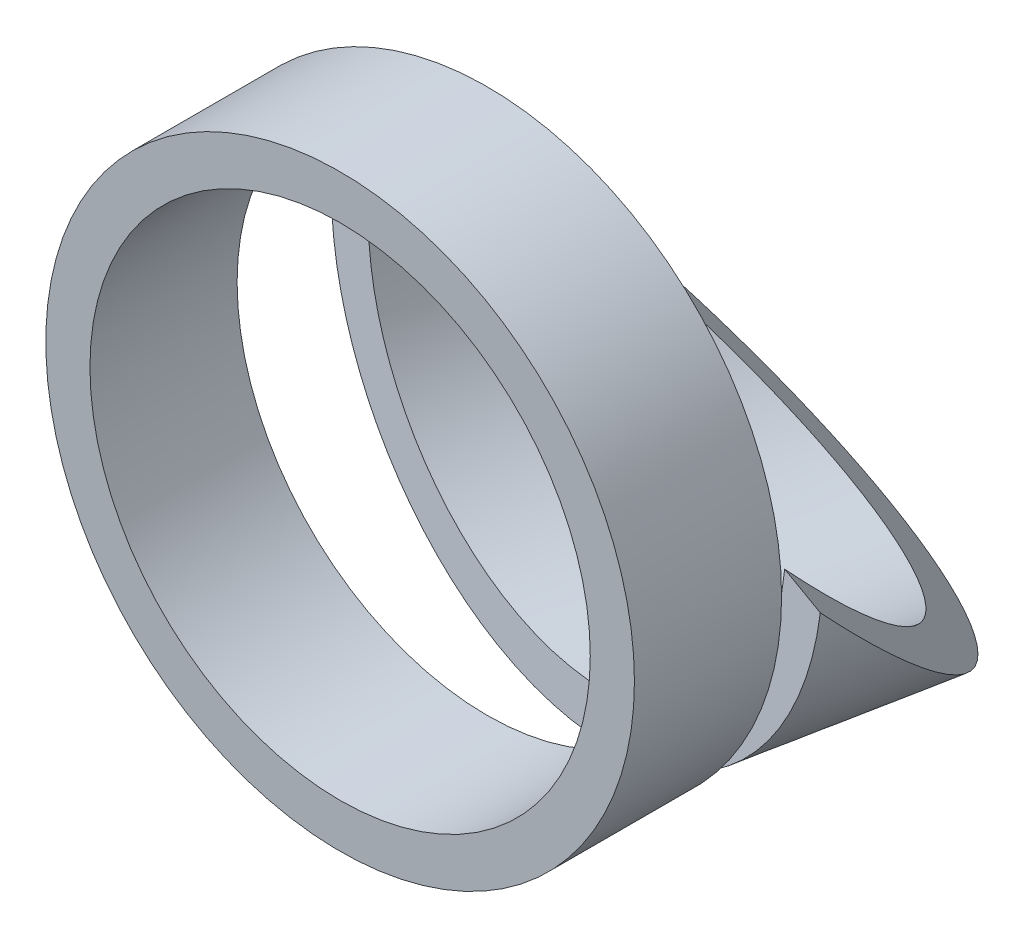
ISO-10303-21;
HEADER;
FILE_DESCRIPTION(('STEP AP214'),'2;1');
FILE_NAME('part.step','',(''),(''),'','','');
FILE_SCHEMA(('AUTOMOTIVE_DESIGN { 1 0 10303 214 1 1 1 1 }'));
ENDSEC;
DATA;
#1=APPLICATION_CONTEXT('core data for automotive mechanical design processes');
#2=APPLICATION_PROTOCOL_DEFINITION('international standard','automotive_design',2000,#1);
#3=PRODUCT_CONTEXT('',#1,'mechanical');
#4=PRODUCT('Part','Part','',(#3));
#5=PRODUCT_RELATED_PRODUCT_CATEGORY('part','',(#4));
#6=PRODUCT_DEFINITION_FORMATION('','',#4);
#7=PRODUCT_DEFINITION_CONTEXT('part definition',#1,'design');
#8=PRODUCT_DEFINITION('design','',#6,#7);
#9=PRODUCT_DEFINITION_SHAPE('','',#8);
#10=(LENGTH_UNIT() NAMED_UNIT(*) SI_UNIT(.MILLI.,.METRE.));
#11=(NAMED_UNIT(*) PLANE_ANGLE_UNIT() SI_UNIT($,.RADIAN.));
#12=(NAMED_UNIT(*) SI_UNIT($,.STERADIAN.) SOLID_ANGLE_UNIT());
#13=UNCERTAINTY_MEASURE_WITH_UNIT(LENGTH_MEASURE(1.E-05),#10,'distance_accuracy_value','');
#14=(GEOMETRIC_REPRESENTATION_CONTEXT(3) GLOBAL_UNCERTAINTY_ASSIGNED_CONTEXT((#13)) GLOBAL_UNIT_ASSIGNED_CONTEXT((#10,
#11,#12)) REPRESENTATION_CONTEXT('',''));
#15=CARTESIAN_POINT('',(0.,0.,0.));
#16=DIRECTION('',(0.,0.,1.));
#17=DIRECTION('',(1.,0.,0.));
#18=AXIS2_PLACEMENT_3D('',#15,#16,#17);
#19=CARTESIAN_POINT('',(11.6426036892653,-1.74656675486041,-76.7329363643441));
#20=DIRECTION('',(0.16261150339795,-0.0243941865043981,-0.986388575880442));
#21=DIRECTION('',(0.97547335491301,-0.146335766243948,0.164431071797738));
#22=AXIS2_PLACEMENT_3D('',#19,#20,#21);
#23=ELLIPSE('',#22,17.2345872769521,17.);
#24=DIRECTION('',(-0.16261150339795,0.0243941865043981,0.986388575880442));
#25=VECTOR('',#24,1.);
#26=SURFACE_OF_LINEAR_EXTRUSION('',#23,#25);
#27=CARTESIAN_POINT('',(-15.084528127993,7.83945222294181,-8.79046131717782));
#28=CARTESIAN_POINT('',(-15.1612871559026,7.60982072736204,-9.04367729737627));
#29=CARTESIAN_POINT('',(-15.2327465143917,7.37805778490592,-9.29652824119867));
#30=CARTESIAN_POINT('',(-15.3650949812378,6.91052197809162,-9.80127243261781));
#31=CARTESIAN_POINT('',(-15.4259844312444,6.6747492436119,-10.0531657109115));
#32=CARTESIAN_POINT('',(-15.5928355151237,5.96182868254518,-10.8070335999664));
#33=CARTESIAN_POINT('',(-15.6829977560136,5.47902487003708,-11.3072553771045));
#34=CARTESIAN_POINT('',(-15.8210783631235,4.50060333773139,-12.300814835782));
#35=CARTESIAN_POINT('',(-15.8689992040649,4.00498637034649,-12.7941529189374));
#36=CARTESIAN_POINT('',(-15.9222541193589,3.00281908147559,-13.7720003392433));
#37=CARTESIAN_POINT('',(-15.9275871977888,2.49626850458289,-14.2565094696629));
#38=CARTESIAN_POINT('',(-15.8949860998728,1.47409772179084,-15.2146178741231));
#39=CARTESIAN_POINT('',(-15.8570428829237,0.958475642974642,-15.6882148474784));
#40=CARTESIAN_POINT('',(-15.7368875187638,-0.0796918860772684,-16.6220038675259));
#41=CARTESIAN_POINT('',(-15.6546780266054,-0.602236919246954,-17.0821967164408));
#42=CARTESIAN_POINT('',(-15.4446273352371,-1.65232854250455,-17.9867329351233));
#43=CARTESIAN_POINT('',(-15.3167659946654,-2.17987724001914,-18.4310692137234));
#44=CARTESIAN_POINT('',(-15.0137435513343,-3.23736060342282,-19.3006495729018));
#45=CARTESIAN_POINT('',(-14.8385751180096,-3.76729562656489,-19.7258906826296));
#46=CARTESIAN_POINT('',(-14.439960665859,-4.82397599651715,-20.5515325488792));
#47=CARTESIAN_POINT('',(-14.2167522642607,-5.35072437312244,-20.9520435090919));
#48=CARTESIAN_POINT('',(-13.7195027496258,-6.39982821453417,-21.7259258924694));
#49=CARTESIAN_POINT('',(-13.445491461004,-6.92218606973253,-22.0993130608835));
#50=CARTESIAN_POINT('',(-12.8929395495554,-7.87450959022972,-22.7561091060301));
#51=CARTESIAN_POINT('',(-12.622296524753,-8.3057564955426,-23.0443043406795));
#52=CARTESIAN_POINT('',(-12.0418973119754,-9.15967294085565,-23.5948659438555));
#53=CARTESIAN_POINT('',(-11.7320856317831,-9.58232930423345,-23.8571947086341));
#54=CARTESIAN_POINT('',(-11.1153005476026,-10.3605504738456,-24.3192809616299));
#55=CARTESIAN_POINT('',(-10.8131395706411,-10.7177241336272,-24.5227431864797));
#56=CARTESIAN_POINT('',(-10.1781564578296,-11.418945283954,-24.9033268864074));
#57=CARTESIAN_POINT('',(-9.8453250788246,-11.7629887729862,-25.0804403784337));
#58=CARTESIAN_POINT('',(-9.14938788479239,-12.4338723000487,-25.404620796724));
#59=CARTESIAN_POINT('',(-8.78630659824553,-12.7607259324971,-25.5517117395526));
#60=CARTESIAN_POINT('',(-8.21977465625378,-13.2348395614637,-25.7470659864906));
#61=CARTESIAN_POINT('',(-8.02730497183963,-13.3901641730571,-25.8079642137614));
#62=CARTESIAN_POINT('',(-7.63515839157118,-13.6949437167717,-25.9209191593396));
#63=CARTESIAN_POINT('',(-7.43547973360242,-13.8443971948933,-25.9729736979677));
#64=CARTESIAN_POINT('',(-6.93536458773105,-14.2043341985135,-26.0896596213785));
#65=CARTESIAN_POINT('',(-6.63099133829897,-14.4111199666546,-26.1489936882329));
#66=CARTESIAN_POINT('',(-6.00878749966748,-14.8087090317112,-26.2463727657671));
#67=CARTESIAN_POINT('',(-5.69096005941419,-14.9995160376503,-26.2844227286695));
#68=CARTESIAN_POINT('',(-5.0435848944515,-15.3631143379301,-26.3380830415423));
#69=CARTESIAN_POINT('',(-4.71404560018054,-15.5359182526137,-26.3537092103166));
#70=CARTESIAN_POINT('',(-4.04503877552488,-15.8617900887659,-26.3616940687417));
#71=CARTESIAN_POINT('',(-3.70557101619074,-16.014857554673,-26.3540522214146));
#72=CARTESIAN_POINT('',(-3.0177107887568,-16.3001639723233,-26.3149145048581));
#73=CARTESIAN_POINT('',(-2.66928794146488,-16.43231676325,-26.2833229128123));
#74=CARTESIAN_POINT('',(-1.96753615035526,-16.6736952750359,-26.1961034554034));
#75=CARTESIAN_POINT('',(-1.61420721510935,-16.7829210359471,-26.1404756320307));
#76=CARTESIAN_POINT('',(-0.905498153477979,-16.9775176641537,-26.0055900943516));
#77=CARTESIAN_POINT('',(-0.550118005519189,-17.0628882800878,-25.9263321310728));
#78=CARTESIAN_POINT('',(0.159824285620089,-17.2093191323934,-25.7450486891533));
#79=CARTESIAN_POINT('',(0.514386446223996,-17.2703798914166,-25.6430237000675));
#80=CARTESIAN_POINT('',(1.19974580243534,-17.3654196533928,-25.4239326237744));
#81=CARTESIAN_POINT('',(1.53074084850867,-17.4007496649581,-25.3080629753883));
#82=CARTESIAN_POINT('',(2.18751352856131,-17.4502197644824,-25.0585129995009));
#83=CARTESIAN_POINT('',(2.51329149933987,-17.4643612258128,-24.9248338269654));
#84=CARTESIAN_POINT('',(3.15798699602995,-17.4721277431898,-24.6410478897222));
#85=CARTESIAN_POINT('',(3.47690180008586,-17.4657448051186,-24.4909347460859));
#86=CARTESIAN_POINT('',(4.10629198212567,-17.4333385769174,-24.1758277835739));
#87=CARTESIAN_POINT('',(4.41676573580707,-17.4073115340207,-24.0108311266882));
#88=CARTESIAN_POINT('',(5.13054742873222,-17.3247914602107,-23.6099136707745));
#89=CARTESIAN_POINT('',(5.53009159294354,-17.2610109129039,-23.3687570225641));
#90=CARTESIAN_POINT('',(6.30991526959748,-17.1029383600174,-22.866105897909));
#91=CARTESIAN_POINT('',(6.69018835721469,-17.0086362551881,-22.6046047114654));
#92=CARTESIAN_POINT('',(7.43033180118239,-16.7922020585684,-22.0643305677596));
#93=CARTESIAN_POINT('',(7.79018780110566,-16.6700506799525,-21.7855457387061));
#94=CARTESIAN_POINT('',(8.48836779710199,-16.4006568036999,-21.2138210157532));
#95=CARTESIAN_POINT('',(8.82669632874324,-16.2534196155312,-20.9208841265496));
#96=CARTESIAN_POINT('',(9.58884807068815,-15.8843786040724,-20.2254291031124));
#97=CARTESIAN_POINT('',(10.0044153420226,-15.6539411143143,-19.8184228373088));
#98=CARTESIAN_POINT('',(10.7967427494077,-15.1586895391894,-18.9892202909863));
#99=CARTESIAN_POINT('',(11.1735461976942,-14.893914585153,-18.5670416909811));
#100=CARTESIAN_POINT('',(11.8891454060057,-14.3344767288322,-17.7114053946686));
#101=CARTESIAN_POINT('',(12.2279759685019,-14.0398416732007,-17.2779584823319));
#102=CARTESIAN_POINT('',(12.8688661915241,-13.4241952805673,-16.4025691312291));
#103=CARTESIAN_POINT('',(13.1709157783733,-13.1031767577285,-15.960624403261));
#104=CARTESIAN_POINT('',(13.7387116702787,-12.4383556863263,-15.0714470845868));
#105=CARTESIAN_POINT('',(14.0044900638168,-12.0945736814578,-14.6242195531687));
#106=CARTESIAN_POINT('',(14.500817387675,-11.3867550409159,-13.7263989423116));
#107=CARTESIAN_POINT('',(14.7313690634156,-11.0227199866987,-13.2758061280223));
#108=CARTESIAN_POINT('',(15.1578627373144,-10.2768705823326,-12.3733308800427));
#109=CARTESIAN_POINT('',(15.3538194791602,-9.8950638942029,-11.9214490795358));
#110=CARTESIAN_POINT('',(15.7117536971458,-9.11566295668596,-11.0180067305567));
#111=CARTESIAN_POINT('',(15.8737301423105,-8.71806822871872,-10.5664461922458));
#112=CARTESIAN_POINT('',(16.3092525830641,-7.50435299423009,-9.21461016607336));
#113=CARTESIAN_POINT('',(16.5326708895886,-6.66680645451547,-8.316583072526));
#114=CARTESIAN_POINT('',(16.7515473075699,-5.46766564409504,-7.07646645858102));
#115=CARTESIAN_POINT('',(16.8032102593787,-5.12384621371022,-6.72590883296589));
#116=CARTESIAN_POINT('',(16.8855371106342,-4.43003067678897,-6.02839929085252));
#117=CARTESIAN_POINT('',(16.9162027996414,-4.08003509924366,-5.68144706955466));
#118=CARTESIAN_POINT('',(16.9565626783666,-3.37168246685846,-4.98905654633948));
#119=CARTESIAN_POINT('',(16.9660814689283,-3.01328021569215,-4.64365444889089));
#120=CARTESIAN_POINT('',(16.9633964195217,-2.29158516047545,-3.95800681293857));
#121=CARTESIAN_POINT('',(16.9511902064844,-1.92829182646346,-3.61776184185323));
#122=CARTESIAN_POINT('',(16.9280032856472,-1.56291546832154,-3.28049384118738));
#123=B_SPLINE_CURVE_WITH_KNOTS('',3,(#27,#28,#29,#30,#31,#32,#33,#34,#35,#36,#37,#38,#39,#40,
#41,#42,#43,#44,#45,#46,#47,#48,#49,#50,#51,#52,#53,#54,#55,#56,#57,#58,#59,#60,#61,#62,#63,#64,
#65,#66,#67,#68,#69,#70,#71,#72,#73,#74,#75,#76,#77,#78,#79,#80,#81,#82,#83,#84,#85,#86,#87,#88,
#89,#90,#91,#92,#93,#94,#95,#96,#97,#98,#99,#100,#101,#102,#103,#104,#105,#106,#107,#108,#109,
#110,#111,#112,#113,#114,#115,#116,#117,#118,#119,#120,#121,#122),.UNSPECIFIED.,.F.,.F.,(4,2,2,
2,2,2,2,2,2,2,2,2,2,2,2,2,2,2,2,2,2,2,2,2,2,2,2,2,2,2,2,2,2,2,2,2,2,2,2,2,2,2,2,2,2,2,2,4),(0.,
1.05093126493312,2.10182855444846,4.20337822235657,6.30480476234849,8.40628044444369,
10.5081952142102,12.6099839270158,14.7127010864378,16.8157442637531,18.9086150125486,
21.0002609858478,22.7536729473742,24.5095974941204,26.0384847992222,27.5678343822507,
29.0959557240452,29.8598214161957,30.6238751039291,31.7408590360565,32.8575829686853,
33.973518723549,35.0894802321033,36.209925708181,37.3303692268908,38.4508245512521,
39.5712557849979,40.6275028117572,41.6836813731287,42.7402713588777,43.7970632443684,
45.2080666664867,46.6195374523421,48.0319887280777,49.4441414258486,51.3184377468362,
53.1906165678065,55.0610652410008,56.9320250511877,58.8013187752338,60.6704667400939,
62.5388161772907,64.4072222927189,68.1415757917396,69.6224750652958,71.1032481086369,
72.5962580130963,74.0894310122632),.UNSPECIFIED.);
#124=CARTESIAN_POINT('',(-15.084528127993,7.83945222294181,-8.79046131717779));
#125=VERTEX_POINT('',#124);
#126=CARTESIAN_POINT('',(16.9280032856472,-1.5629154683215,-3.28049384118742));
#127=VERTEX_POINT('',#126);
#128=EDGE_CURVE('E12',#125,#127,#123,.T.);
#129=ORIENTED_EDGE('',*,*,#128,.F.);
#130=CARTESIAN_POINT('',(0.,0.,-6.10981910252094));
#131=DIRECTION('',(0.16261150339795,-0.0243941865043981,-0.986388575880442));
#132=DIRECTION('',(0.97547335491301,-0.146335766243948,0.164431071797738));
#133=AXIS2_PLACEMENT_3D('',#130,#131,#132);
#134=ELLIPSE('',#133,17.2345872769521,17.);
#135=EDGE_CURVE('E79',#127,#125,#134,.T.);
#136=ORIENTED_EDGE('',*,*,#135,.F.);
#137=EDGE_LOOP('',(#129,#136));
#138=FACE_BOUND('',#137,.T.);
#139=ADVANCED_FACE('F41',(#138),#26,.T.);
#140=CARTESIAN_POINT('',(11.6426036892653,-1.74656675486041,-76.7329363643441));
#141=DIRECTION('',(0.16261150339795,-0.0243941865043981,-0.986388575880442));
#142=DIRECTION('',(0.975473354913011,-0.146335766243947,0.164431071797738));
#143=AXIS2_PLACEMENT_3D('',#140,#141,#142);
#144=ELLIPSE('',#143,20.2759850317084,20.);
#145=DIRECTION('',(-0.16261150339795,0.0243941865043981,0.986388575880442));
#146=VECTOR('',#145,1.);
#147=SURFACE_OF_LINEAR_EXTRUSION('',#144,#146);
#148=CARTESIAN_POINT('',(0.,0.,-6.10981910252094));
#149=DIRECTION('',(0.16261150339795,-0.0243941865043981,-0.986388575880442));
#150=DIRECTION('',(0.975473354913011,-0.146335766243947,0.164431071797738));
#151=AXIS2_PLACEMENT_3D('',#148,#149,#150);
#152=ELLIPSE('',#151,20.2759850317084,20.);
#153=CARTESIAN_POINT('',(19.8528113921095,-2.42195785044404,-2.77707855884412));
#154=VERTEX_POINT('',#153);
#155=CARTESIAN_POINT('',(-18.0093362344553,8.69849460506436,-9.29387659952106));
#156=VERTEX_POINT('',#155);
#157=EDGE_CURVE('E82',#154,#156,#152,.T.);
#158=ORIENTED_EDGE('',*,*,#157,.T.);
#159=CARTESIAN_POINT('',(-18.0093362344553,8.69849460506436,-9.29387659952107));
#160=CARTESIAN_POINT('',(-18.0914126977773,8.42508600412214,-9.59115828242779));
#161=CARTESIAN_POINT('',(-18.16727083154,8.14928295631096,-9.88791032041356));
#162=CARTESIAN_POINT('',(-18.3065702934418,7.59317418992581,-10.4800916658109));
#163=CARTESIAN_POINT('',(-18.3700119641421,7.31286859580477,-10.7755210094948));
#164=CARTESIAN_POINT('',(-18.5417405274643,6.46564299976884,-11.6594142300617));
#165=CARTESIAN_POINT('',(-18.6314421643313,5.89237680219224,-12.2455239294427));
#166=CARTESIAN_POINT('',(-18.7610489110114,4.731527514306,-13.4088785065568));
#167=CARTESIAN_POINT('',(-18.8009557512911,4.14394492224263,-13.9861236916606));
#168=CARTESIAN_POINT('',(-18.8304437980177,2.95668178662402,-15.1293984308567));
#169=CARTESIAN_POINT('',(-18.8200248362866,2.35700120264654,-15.6954279474623));
#170=CARTESIAN_POINT('',(-18.7479357658123,1.1477024446657,-16.8137972550702));
#171=CARTESIAN_POINT('',(-18.6862520065336,0.538081666228179,-17.3661333595134));
#172=CARTESIAN_POINT('',(-18.5103294531923,-0.688481179262389,-18.4540369221401));
#173=CARTESIAN_POINT('',(-18.3960942834567,-1.30542273856309,-18.9896055340114));
#174=CARTESIAN_POINT('',(-18.1133109618741,-2.54435657780149,-20.0410191598345));
#175=CARTESIAN_POINT('',(-17.9447317958213,-3.16635154365945,-20.5568527224554));
#176=CARTESIAN_POINT('',(-17.5512037327571,-4.41200928488219,-21.5646476913425));
#177=CARTESIAN_POINT('',(-17.3262533028269,-5.03567210514501,-22.0566084479949));
#178=CARTESIAN_POINT('',(-16.8254969433132,-6.26158886901665,-22.9971854921561));
#179=CARTESIAN_POINT('',(-16.5514904024458,-6.86390535991127,-23.4466740042377));
#180=CARTESIAN_POINT('',(-15.9458911813112,-8.06249728991044,-24.3138927088897));
#181=CARTESIAN_POINT('',(-15.6143086922699,-8.65877377839021,-24.731628503065));
#182=CARTESIAN_POINT('',(-14.9489065476291,-9.74572787637618,-25.4655878305361));
#183=CARTESIAN_POINT('',(-14.6239094081072,-10.2380554420413,-25.7873663812077));
#184=CARTESIAN_POINT('',(-13.9301536755608,-11.2110638127263,-26.4000739678701));
#185=CARTESIAN_POINT('',(-13.5614006609854,-11.6917460930179,-26.6910069274383));
#186=CARTESIAN_POINT('',(-12.834238498173,-12.570270916617,-27.1987034317212));
#187=CARTESIAN_POINT('',(-12.481678040692,-12.970250911654,-27.4201428268158));
#188=CARTESIAN_POINT('',(-11.7433836584537,-13.7545434715208,-27.833127580188));
#189=CARTESIAN_POINT('',(-11.3576649951125,-14.1388631253977,-28.0246865781779));
#190=CARTESIAN_POINT('',(-10.6036770340228,-14.840964312226,-28.3523591386163));
#191=CARTESIAN_POINT('',(-10.2392686478517,-15.1610524108524,-28.4924117194957));
#192=CARTESIAN_POINT('',(-9.48556395197012,-15.7834588859924,-28.7443642026529));
#193=CARTESIAN_POINT('',(-9.0962434290237,-16.0857594090384,-28.8562361772724));
#194=CARTESIAN_POINT('',(-8.32919246949396,-16.6435603309996,-29.0406736246002));
#195=CARTESIAN_POINT('',(-7.95337912765805,-16.9008463937873,-29.1158044293149));
#196=CARTESIAN_POINT('',(-7.18391329461181,-17.3948277859898,-29.2384121014589));
#197=CARTESIAN_POINT('',(-6.79025633389364,-17.6315179126572,-29.2858819986073));
#198=CARTESIAN_POINT('',(-5.98727339833563,-18.0815748329745,-29.3515472973334));
#199=CARTESIAN_POINT('',(-5.57794293488235,-18.294934876824,-29.3697342476213));
#200=CARTESIAN_POINT('',(-4.74654583796233,-18.6956606735069,-29.3756162391459));
#201=CARTESIAN_POINT('',(-4.32448062912227,-18.8830293209484,-29.3633146787086));
#202=CARTESIAN_POINT('',(-3.48434912143259,-19.2240871716905,-29.3084638631567));
#203=CARTESIAN_POINT('',(-3.06657502242118,-19.3786507517037,-29.2668787528635));
#204=CARTESIAN_POINT('',(-2.2255330700482,-19.6597000438343,-29.1545046629459));
#205=CARTESIAN_POINT('',(-1.80226522105879,-19.7861857782958,-29.0837157065619));
#206=CARTESIAN_POINT('',(-0.953929022201056,-20.009975723801,-28.9135516029447));
#207=CARTESIAN_POINT('',(-0.528861298030382,-20.1072893469544,-28.8141856961157));
#208=CARTESIAN_POINT('',(0.319687287675094,-20.2723290343488,-28.5880111618489));
#209=CARTESIAN_POINT('',(0.743168195736665,-20.3400559729336,-28.4612033455384));
#210=CARTESIAN_POINT('',(1.55494098650931,-20.4422554345733,-28.1918315888147));
#211=CARTESIAN_POINT('',(1.94357411921073,-20.4787684712115,-28.0510555446422));
#212=CARTESIAN_POINT('',(2.7142366562433,-20.5269648247242,-27.7488547979791));
#213=CARTESIAN_POINT('',(3.0962665756419,-20.5386500869768,-27.5874317143364));
#214=CARTESIAN_POINT('',(3.85186365208308,-20.538042395987,-27.2455869278481));
#215=CARTESIAN_POINT('',(4.22542732667685,-20.5257397505223,-27.0651575734563));
#216=CARTESIAN_POINT('',(4.9622988585294,-20.478232250068,-26.6871341505519));
#217=CARTESIAN_POINT('',(5.32560471943387,-20.4430229686584,-26.4895367709294));
#218=CARTESIAN_POINT('',(6.1656744501092,-20.334825304689,-26.0071429678011));
#219=CARTESIAN_POINT('',(6.63768272653817,-20.2529310218234,-25.7160183832745));
#220=CARTESIAN_POINT('',(7.55818778390858,-20.0529522800451,-25.109944860691));
#221=CARTESIAN_POINT('',(8.0066764950507,-19.9348554936048,-24.7949878348663));
#222=CARTESIAN_POINT('',(8.87889665706182,-19.6657223368225,-24.1449057738648));
#223=CARTESIAN_POINT('',(9.302609765148,-19.5146619435683,-23.8097661598541));
#224=CARTESIAN_POINT('',(10.124005630698,-19.1829099369846,-23.1230425914489));
#225=CARTESIAN_POINT('',(10.5216939234505,-19.0022246535007,-22.7714621613512));
#226=CARTESIAN_POINT('',(11.4178079770291,-18.5501076783345,-21.9364368207348));
#227=CARTESIAN_POINT('',(11.9061906090423,-18.2684024658351,-21.4477502633185));
#228=CARTESIAN_POINT('',(12.8361305393569,-17.6643905432178,-20.4528841247966));
#229=CARTESIAN_POINT('',(13.277740698972,-17.3421305887975,-19.9467251677059));
#230=CARTESIAN_POINT('',(14.1151839210672,-16.6623550585856,-18.921528634352));
#231=CARTESIAN_POINT('',(14.5110585733737,-16.3048720700889,-18.4025032883625));
#232=CARTESIAN_POINT('',(15.2585478903114,-15.5588166868307,-17.3548538933039));
#233=CARTESIAN_POINT('',(15.6101500702578,-15.1702355728062,-16.826227184557));
#234=CARTESIAN_POINT('',(16.2696880153101,-14.3662543101472,-15.7631712257544));
#235=CARTESIAN_POINT('',(16.5776616606626,-13.9508778882002,-15.2287474484846));
#236=CARTESIAN_POINT('',(17.1512104367657,-13.0963065988369,-14.1563804607718));
#237=CARTESIAN_POINT('',(17.416789747842,-12.6571140855531,-13.6184376027825));
#238=CARTESIAN_POINT('',(17.906273570856,-11.7578746982735,-12.5415266011522));
#239=CARTESIAN_POINT('',(18.1301964669281,-11.2978371357854,-12.0025590163528));
#240=CARTESIAN_POINT('',(18.5371463160348,-10.3591274445843,-10.9253594393491));
#241=CARTESIAN_POINT('',(18.7201689474261,-9.88045335294913,-10.3871275308446));
#242=CARTESIAN_POINT('',(19.0641247074186,-8.85157653011757,-9.25256436572503));
#243=CARTESIAN_POINT('',(19.2202192388794,-8.29940641295968,-8.65654604361283));
#244=CARTESIAN_POINT('',(19.4824620704875,-7.17749068946817,-7.47034052436699));
#245=CARTESIAN_POINT('',(19.5886182547372,-6.60774787259924,-6.88015242119101));
#246=CARTESIAN_POINT('',(19.7521662791647,-5.44432767716395,-5.69902140549677));
#247=CARTESIAN_POINT('',(19.8088036212348,-4.85041958470675,-5.10819968524215));
#248=CARTESIAN_POINT('',(19.8548557198693,-3.94845442897735,-4.22897101212677));
#249=CARTESIAN_POINT('',(19.8636992337058,-3.64528422258121,-3.93644001362818));
#250=CARTESIAN_POINT('',(19.8681847282917,-3.03585771496102,-3.35440337118385));
#251=CARTESIAN_POINT('',(19.8638244357225,-2.72960089135724,-3.0648982568199));
#252=CARTESIAN_POINT('',(19.8528113921095,-2.42195785044406,-2.77707855884411));
#253=B_SPLINE_CURVE_WITH_KNOTS('',3,(#159,#160,#161,#162,#163,#164,#165,#166,#167,#168,#169,
#170,#171,#172,#173,#174,#175,#176,#177,#178,#179,#180,#181,#182,#183,#184,#185,#186,#187,#188,
#189,#190,#191,#192,#193,#194,#195,#196,#197,#198,#199,#200,#201,#202,#203,#204,#205,#206,#207,
#208,#209,#210,#211,#212,#213,#214,#215,#216,#217,#218,#219,#220,#221,#222,#223,#224,#225,#226,
#227,#228,#229,#230,#231,#232,#233,#234,#235,#236,#237,#238,#239,#240,#241,#242,#243,#244,#245,
#246,#247,#248,#249,#250,#251,#252),.UNSPECIFIED.,.F.,.F.,(4,2,2,2,2,2,2,2,2,2,2,2,2,2,2,2,2,2,
2,2,2,2,2,2,2,2,2,2,2,2,2,2,2,2,2,2,2,2,2,2,2,2,2,2,2,2,4),(0.,1.23632487929271,2.4726156444697,
4.94502848138209,7.41735539471764,9.889690570048,12.3626842775036,14.8355074549132,
17.3097443823259,19.7840485996226,22.1813940052685,24.5783155007562,26.5922595991362,
28.6059472145074,30.3362215426414,32.0657037143661,33.5786674672312,35.0931247563827,
36.4764012018065,37.8600260689265,39.2440501895803,40.6279200503686,41.968236542921,
43.3085519688571,44.64843448793,45.988277408199,47.2318059645528,48.4752370807423,
49.7191707046263,50.9633447745004,52.6426344050293,54.3224964967349,56.0035869358642,
57.6843186493141,59.9194656096724,62.1520588726298,64.3826056631325,66.6137800581251,
68.8430052161842,71.0720104238301,73.3000295635731,75.5282840112298,78.0085231595686,
80.4883706043627,83.0053750789541,84.2693306837643,85.5335039180158),.UNSPECIFIED.);
#254=EDGE_CURVE('E73',#156,#154,#253,.T.);
#255=ORIENTED_EDGE('',*,*,#254,.T.);
#256=EDGE_LOOP('',(#158,#255));
#257=FACE_BOUND('',#256,.T.);
#258=ADVANCED_FACE('F43',(#257),#147,.F.);
#259=CARTESIAN_POINT('',(0.,0.,-6.10981910252094));
#260=DIRECTION('',(0.16261150339795,-0.0243941865043981,-0.986388575880442));
#261=DIRECTION('',(-0.98668219518078,0.,-0.162659908131157));
#262=AXIS2_PLACEMENT_3D('',#259,#260,#261);
#263=PLANE('',#262);
#264=ORIENTED_EDGE('',*,*,#157,.F.);
#265=DIRECTION('',(-0.946649738355044,0.27803952145627,-0.162936482657183));
#266=VECTOR('',#265,1.);
#267=CARTESIAN_POINT('',(0.910270861354842,3.14163625511065,-6.03745122005191));
#268=LINE('',#267,#266);
#269=EDGE_CURVE('E57',#154,#127,#268,.T.);
#270=ORIENTED_EDGE('',*,*,#269,.T.);
#271=ORIENTED_EDGE('',*,*,#135,.T.);
#272=EDGE_CURVE('E69',#125,#156,#268,.T.);
#273=ORIENTED_EDGE('',*,*,#272,.T.);
#274=EDGE_LOOP('',(#264,#270,#271,#273));
#275=FACE_BOUND('',#274,.T.);
#276=ADVANCED_FACE('F80',(#275),#263,.F.);
#277=CARTESIAN_POINT('',(2521.87411316963,-753.892023462612,412.066004936618));
#278=DIRECTION('',(-0.310945598507739,-0.65523310047211,0.688463810824047));
#279=DIRECTION('',(0.,0.724372619296341,0.689408665751858));
#280=AXIS2_PLACEMENT_3D('',#277,#278,#279);
#281=PLANE('',#280);
#282=ORIENTED_EDGE('',*,*,#272,.F.);
#283=ORIENTED_EDGE('',*,*,#128,.T.);
#284=ORIENTED_EDGE('',*,*,#269,.F.);
#285=ORIENTED_EDGE('',*,*,#254,.F.);
#286=EDGE_LOOP('',(#282,#283,#284,#285));
#287=FACE_BOUND('',#286,.T.);
#288=ADVANCED_FACE('F71',(#287),#281,.F.);
#289=CLOSED_SHELL('',(#139,#258,#276,#288));
#290=MANIFOLD_SOLID_BREP('B2',#289);
#291=CARTESIAN_POINT('',(0.,0.,10.));
#292=DIRECTION('',(0.,0.,1.));
#293=DIRECTION('',(1.,0.,0.));
#294=AXIS2_PLACEMENT_3D('',#291,#292,#293);
#295=PLANE('',#294);
#296=CARTESIAN_POINT('',(0.,0.,10.));
#297=DIRECTION('',(0.,0.,1.));
#298=DIRECTION('',(1.,0.,0.));
#299=AXIS2_PLACEMENT_3D('',#296,#297,#298);
#300=CIRCLE('',#299,20.);
#301=CARTESIAN_POINT('',(20.,0.,10.));
#302=VERTEX_POINT('',#301);
#303=EDGE_CURVE('E40',#302,#302,#300,.T.);
#304=ORIENTED_EDGE('',*,*,#303,.T.);
#305=EDGE_LOOP('',(#304));
#306=FACE_BOUND('',#305,.T.);
#307=CARTESIAN_POINT('',(0.,0.,10.));
#308=DIRECTION('',(0.,0.,1.));
#309=DIRECTION('',(1.,0.,0.));
#310=AXIS2_PLACEMENT_3D('',#307,#308,#309);
#311=CIRCLE('',#310,17.);
#312=CARTESIAN_POINT('',(17.,0.,10.));
#313=VERTEX_POINT('',#312);
#314=EDGE_CURVE('E143',#313,#313,#311,.T.);
#315=ORIENTED_EDGE('',*,*,#314,.F.);
#316=EDGE_LOOP('',(#315));
#317=FACE_BOUND('',#316,.T.);
#318=ADVANCED_FACE('F132',(#306,#317),#295,.T.);
#319=CARTESIAN_POINT('',(0.,0.,0.));
#320=DIRECTION('',(0.,0.,1.));
#321=DIRECTION('',(1.,0.,0.));
#322=AXIS2_PLACEMENT_3D('',#319,#320,#321);
#323=PLANE('',#322);
#324=CARTESIAN_POINT('',(0.,0.,0.));
#325=DIRECTION('',(0.,0.,1.));
#326=DIRECTION('',(1.,0.,0.));
#327=AXIS2_PLACEMENT_3D('',#324,#325,#326);
#328=CIRCLE('',#327,20.);
#329=CARTESIAN_POINT('',(20.,0.,0.));
#330=VERTEX_POINT('',#329);
#331=EDGE_CURVE('E136',#330,#330,#328,.T.);
#332=ORIENTED_EDGE('',*,*,#331,.F.);
#333=EDGE_LOOP('',(#332));
#334=FACE_BOUND('',#333,.T.);
#335=CARTESIAN_POINT('',(0.,0.,0.));
#336=DIRECTION('',(0.,0.,1.));
#337=DIRECTION('',(1.,0.,0.));
#338=AXIS2_PLACEMENT_3D('',#335,#336,#337);
#339=CIRCLE('',#338,17.);
#340=CARTESIAN_POINT('',(17.,0.,0.));
#341=VERTEX_POINT('',#340);
#342=EDGE_CURVE('E145',#341,#341,#339,.T.);
#343=ORIENTED_EDGE('',*,*,#342,.T.);
#344=EDGE_LOOP('',(#343));
#345=FACE_BOUND('',#344,.T.);
#346=ADVANCED_FACE('F155',(#334,#345),#323,.F.);
#347=CARTESIAN_POINT('',(0.,0.,10.));
#348=DIRECTION('',(0.,0.,-1.));
#349=DIRECTION('',(-1.,0.,0.));
#350=AXIS2_PLACEMENT_3D('',#347,#348,#349);
#351=CYLINDRICAL_SURFACE('',#350,20.);
#352=ORIENTED_EDGE('',*,*,#303,.F.);
#353=EDGE_LOOP('',(#352));
#354=FACE_BOUND('',#353,.T.);
#355=ORIENTED_EDGE('',*,*,#331,.T.);
#356=EDGE_LOOP('',(#355));
#357=FACE_BOUND('',#356,.T.);
#358=ADVANCED_FACE('F134',(#354,#357),#351,.T.);
#359=CARTESIAN_POINT('',(0.,0.,10.));
#360=DIRECTION('',(0.,0.,-1.));
#361=DIRECTION('',(-1.,0.,0.));
#362=AXIS2_PLACEMENT_3D('',#359,#360,#361);
#363=CYLINDRICAL_SURFACE('',#362,17.);
#364=ORIENTED_EDGE('',*,*,#314,.T.);
#365=EDGE_LOOP('',(#364));
#366=FACE_BOUND('',#365,.T.);
#367=ORIENTED_EDGE('',*,*,#342,.F.);
#368=EDGE_LOOP('',(#367));
#369=FACE_BOUND('',#368,.T.);
#370=ADVANCED_FACE('F151',(#366,#369),#363,.F.);
#371=CLOSED_SHELL('',(#318,#346,#358,#370));
#372=MANIFOLD_SOLID_BREP('B6',#371);
#373=ADVANCED_BREP_SHAPE_REPRESENTATION('',(#18,#290,#372),#14);
#374=SHAPE_DEFINITION_REPRESENTATION(#9,#373);
ENDSEC;
END-ISO-10303-21;
